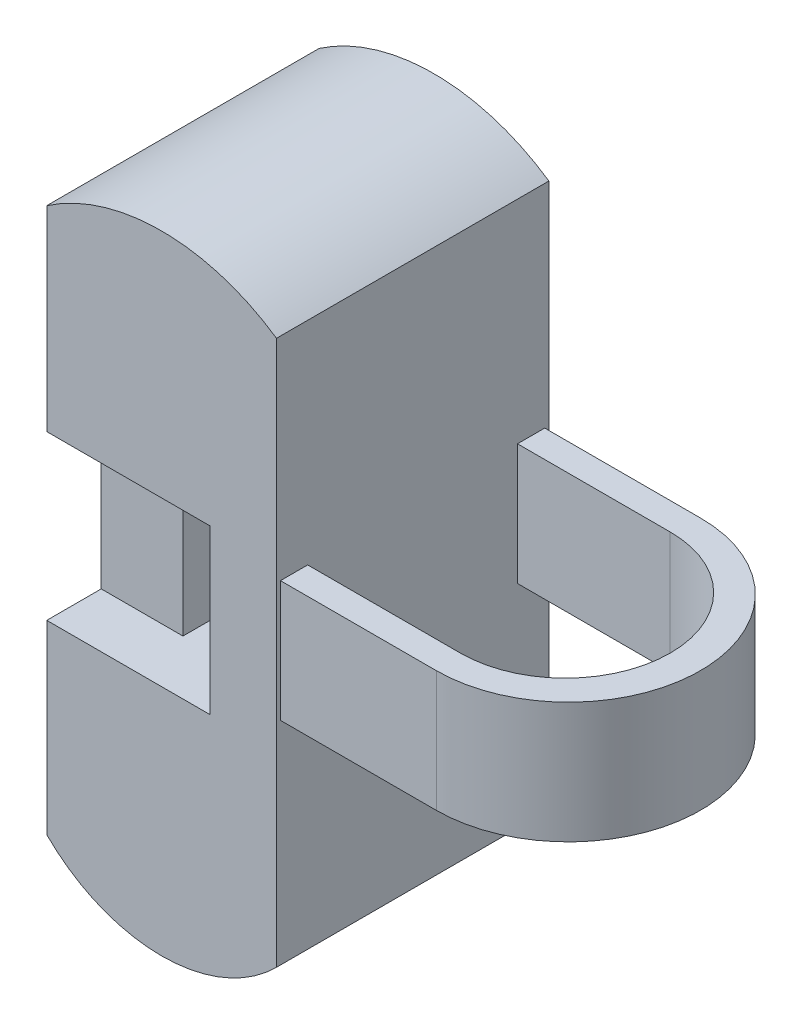
ISO-10303-21;
HEADER;
FILE_DESCRIPTION(('STEP AP214'),'2;1');
FILE_NAME('part.step','',(''),(''),'','','');
FILE_SCHEMA(('AUTOMOTIVE_DESIGN { 1 0 10303 214 1 1 1 1 }'));
ENDSEC;
DATA;
#1=APPLICATION_CONTEXT('core data for automotive mechanical design processes');
#2=APPLICATION_PROTOCOL_DEFINITION('international standard','automotive_design',2000,#1);
#3=PRODUCT_CONTEXT('',#1,'mechanical');
#4=PRODUCT('Part','Part','',(#3));
#5=PRODUCT_RELATED_PRODUCT_CATEGORY('part','',(#4));
#6=PRODUCT_DEFINITION_FORMATION('','',#4);
#7=PRODUCT_DEFINITION_CONTEXT('part definition',#1,'design');
#8=PRODUCT_DEFINITION('design','',#6,#7);
#9=PRODUCT_DEFINITION_SHAPE('','',#8);
#10=(LENGTH_UNIT() NAMED_UNIT(*) SI_UNIT(.MILLI.,.METRE.));
#11=(NAMED_UNIT(*) PLANE_ANGLE_UNIT() SI_UNIT($,.RADIAN.));
#12=(NAMED_UNIT(*) SI_UNIT($,.STERADIAN.) SOLID_ANGLE_UNIT());
#13=UNCERTAINTY_MEASURE_WITH_UNIT(LENGTH_MEASURE(1.E-05),#10,'distance_accuracy_value','');
#14=(GEOMETRIC_REPRESENTATION_CONTEXT(3) GLOBAL_UNCERTAINTY_ASSIGNED_CONTEXT((#13)) GLOBAL_UNIT_ASSIGNED_CONTEXT((#10,
#11,#12)) REPRESENTATION_CONTEXT('',''));
#15=CARTESIAN_POINT('',(0.,0.,0.));
#16=DIRECTION('',(0.,0.,1.));
#17=DIRECTION('',(1.,0.,0.));
#18=AXIS2_PLACEMENT_3D('',#15,#16,#17);
#19=CARTESIAN_POINT('',(0.,0.,5.));
#20=DIRECTION('',(1.,0.,0.));
#21=DIRECTION('',(0.,1.,0.));
#22=AXIS2_PLACEMENT_3D('',#19,#20,#21);
#23=PLANE('',#22);
#24=DIRECTION('',(0.,0.,1.));
#25=VECTOR('',#24,1.);
#26=CARTESIAN_POINT('',(0.,-13.1854201107124,3.));
#27=LINE('',#26,#25);
#28=CARTESIAN_POINT('',(0.,-13.1854201107124,3.));
#29=VERTEX_POINT('',#28);
#30=CARTESIAN_POINT('',(0.,-13.1854201107124,5.));
#31=VERTEX_POINT('',#30);
#32=EDGE_CURVE('E345',#29,#31,#27,.T.);
#33=ORIENTED_EDGE('',*,*,#32,.F.);
#34=DIRECTION('',(0.,-1.,0.));
#35=VECTOR('',#34,1.);
#36=CARTESIAN_POINT('',(0.,-7.18542011071244,3.));
#37=LINE('',#36,#35);
#38=CARTESIAN_POINT('',(0.,-7.18542011071244,3.));
#39=VERTEX_POINT('',#38);
#40=EDGE_CURVE('E175',#39,#29,#37,.T.);
#41=ORIENTED_EDGE('',*,*,#40,.F.);
#42=DIRECTION('',(0.,0.,1.));
#43=VECTOR('',#42,1.);
#44=CARTESIAN_POINT('',(0.,-7.18542011071244,3.));
#45=LINE('',#44,#43);
#46=CARTESIAN_POINT('',(0.,-7.18542011071244,5.));
#47=VERTEX_POINT('',#46);
#48=EDGE_CURVE('E348',#39,#47,#45,.T.);
#49=ORIENTED_EDGE('',*,*,#48,.T.);
#50=DIRECTION('',(0.,-1.,0.));
#51=VECTOR('',#50,1.);
#52=CARTESIAN_POINT('',(0.,0.,5.));
#53=LINE('',#52,#51);
#54=CARTESIAN_POINT('',(0.,0.,5.));
#55=VERTEX_POINT('',#54);
#56=EDGE_CURVE('E236',#55,#47,#53,.T.);
#57=ORIENTED_EDGE('',*,*,#56,.F.);
#58=DIRECTION('',(0.,0.,-1.));
#59=VECTOR('',#58,1.);
#60=CARTESIAN_POINT('',(0.,0.,5.));
#61=LINE('',#60,#59);
#62=CARTESIAN_POINT('',(0.,0.,-5.));
#63=VERTEX_POINT('',#62);
#64=EDGE_CURVE('E249',#55,#63,#61,.T.);
#65=ORIENTED_EDGE('',*,*,#64,.T.);
#66=DIRECTION('',(0.,-1.,0.));
#67=VECTOR('',#66,1.);
#68=CARTESIAN_POINT('',(0.,0.,-5.));
#69=LINE('',#68,#67);
#70=CARTESIAN_POINT('',(0.,-7.18542011071244,-5.));
#71=VERTEX_POINT('',#70);
#72=EDGE_CURVE('E250',#63,#71,#69,.T.);
#73=ORIENTED_EDGE('',*,*,#72,.T.);
#74=DIRECTION('',(0.,0.,-1.));
#75=VECTOR('',#74,1.);
#76=CARTESIAN_POINT('',(0.,-7.18542011071244,-3.));
#77=LINE('',#76,#75);
#78=CARTESIAN_POINT('',(0.,-7.18542011071244,-3.));
#79=VERTEX_POINT('',#78);
#80=EDGE_CURVE('E362',#79,#71,#77,.T.);
#81=ORIENTED_EDGE('',*,*,#80,.F.);
#82=DIRECTION('',(0.,-1.,0.));
#83=VECTOR('',#82,1.);
#84=CARTESIAN_POINT('',(0.,-7.18542011071244,-3.));
#85=LINE('',#84,#83);
#86=CARTESIAN_POINT('',(0.,-13.1854201107124,-3.));
#87=VERTEX_POINT('',#86);
#88=EDGE_CURVE('E356',#79,#87,#85,.T.);
#89=ORIENTED_EDGE('',*,*,#88,.T.);
#90=DIRECTION('',(0.,0.,-1.));
#91=VECTOR('',#90,1.);
#92=CARTESIAN_POINT('',(0.,-13.1854201107124,-3.));
#93=LINE('',#92,#91);
#94=CARTESIAN_POINT('',(0.,-13.1854201107124,-5.));
#95=VERTEX_POINT('',#94);
#96=EDGE_CURVE('E361',#87,#95,#93,.T.);
#97=ORIENTED_EDGE('',*,*,#96,.T.);
#98=CARTESIAN_POINT('',(0.,-20.,-5.));
#99=VERTEX_POINT('',#98);
#100=EDGE_CURVE('E235',#95,#99,#69,.T.);
#101=ORIENTED_EDGE('',*,*,#100,.T.);
#102=DIRECTION('',(0.,0.,-1.));
#103=VECTOR('',#102,1.);
#104=CARTESIAN_POINT('',(0.,-20.,5.));
#105=LINE('',#104,#103);
#106=CARTESIAN_POINT('',(0.,-20.,5.));
#107=VERTEX_POINT('',#106);
#108=EDGE_CURVE('E267',#107,#99,#105,.T.);
#109=ORIENTED_EDGE('',*,*,#108,.F.);
#110=EDGE_CURVE('E240',#31,#107,#53,.T.);
#111=ORIENTED_EDGE('',*,*,#110,.F.);
#112=EDGE_LOOP('',(#33,#41,#49,#57,#65,#73,#81,#89,#97,#101,#109,#111));
#113=FACE_BOUND('',#112,.T.);
#114=ADVANCED_FACE('F33',(#113),#23,.F.);
#115=CARTESIAN_POINT('',(4.21707699545243,-15.7829230045476,5.));
#116=DIRECTION('',(0.,0.,-1.));
#117=DIRECTION('',(-1.,0.,0.));
#118=AXIS2_PLACEMENT_3D('',#115,#116,#117);
#119=PLANE('',#118);
#120=DIRECTION('',(1.,0.,0.));
#121=VECTOR('',#120,1.);
#122=CARTESIAN_POINT('',(3.,-13.1854201107124,5.));
#123=LINE('',#122,#121);
#124=CARTESIAN_POINT('',(6.,-13.1854201107124,5.));
#125=VERTEX_POINT('',#124);
#126=EDGE_CURVE('E365',#31,#125,#123,.T.);
#127=ORIENTED_EDGE('',*,*,#126,.F.);
#128=ORIENTED_EDGE('',*,*,#110,.T.);
#129=CARTESIAN_POINT('',(4.21707699545243,-15.7829230045476,5.));
#130=DIRECTION('',(0.,0.,-1.));
#131=DIRECTION('',(-1.,0.,0.));
#132=AXIS2_PLACEMENT_3D('',#129,#130,#131);
#133=CIRCLE('',#132,5.96384748054041);
#134=CARTESIAN_POINT('',(8.43415399090486,-20.,5.));
#135=VERTEX_POINT('',#134);
#136=EDGE_CURVE('E239',#135,#107,#133,.T.);
#137=ORIENTED_EDGE('',*,*,#136,.F.);
#138=DIRECTION('',(0.,-1.,0.));
#139=VECTOR('',#138,1.);
#140=CARTESIAN_POINT('',(8.43415399090486,0.,5.));
#141=LINE('',#140,#139);
#142=CARTESIAN_POINT('',(8.43415399090486,0.,5.));
#143=VERTEX_POINT('',#142);
#144=EDGE_CURVE('E243',#143,#135,#141,.T.);
#145=ORIENTED_EDGE('',*,*,#144,.F.);
#146=CARTESIAN_POINT('',(4.21707699545243,-6.16071428571429,5.));
#147=DIRECTION('',(0.,0.,-1.));
#148=DIRECTION('',(-1.,0.,0.));
#149=AXIS2_PLACEMENT_3D('',#146,#147,#148);
#150=CIRCLE('',#149,7.46579794099587);
#151=EDGE_CURVE('E246',#55,#143,#150,.T.);
#152=ORIENTED_EDGE('',*,*,#151,.F.);
#153=ORIENTED_EDGE('',*,*,#56,.T.);
#154=DIRECTION('',(1.,0.,0.));
#155=VECTOR('',#154,1.);
#156=CARTESIAN_POINT('',(3.,-7.18542011071244,5.));
#157=LINE('',#156,#155);
#158=CARTESIAN_POINT('',(6.,-7.18542011071244,5.));
#159=VERTEX_POINT('',#158);
#160=EDGE_CURVE('E371',#47,#159,#157,.T.);
#161=ORIENTED_EDGE('',*,*,#160,.T.);
#162=DIRECTION('',(0.,-1.,0.));
#163=VECTOR('',#162,1.);
#164=CARTESIAN_POINT('',(6.,-7.18542011071244,5.));
#165=LINE('',#164,#163);
#166=EDGE_CURVE('E374',#159,#125,#165,.T.);
#167=ORIENTED_EDGE('',*,*,#166,.T.);
#168=EDGE_LOOP('',(#127,#128,#137,#145,#152,#153,#161,#167));
#169=FACE_BOUND('',#168,.T.);
#170=ADVANCED_FACE('F336',(#169),#119,.F.);
#171=CARTESIAN_POINT('',(4.21707699545243,-15.7829230045476,-5.));
#172=DIRECTION('',(0.,0.,-1.));
#173=DIRECTION('',(-1.,0.,0.));
#174=AXIS2_PLACEMENT_3D('',#171,#172,#173);
#175=PLANE('',#174);
#176=DIRECTION('',(1.,0.,0.));
#177=VECTOR('',#176,1.);
#178=CARTESIAN_POINT('',(3.,-7.18542011071244,-5.));
#179=LINE('',#178,#177);
#180=CARTESIAN_POINT('',(6.,-7.18542011071244,-5.));
#181=VERTEX_POINT('',#180);
#182=EDGE_CURVE('E190',#71,#181,#179,.T.);
#183=ORIENTED_EDGE('',*,*,#182,.F.);
#184=ORIENTED_EDGE('',*,*,#72,.F.);
#185=CARTESIAN_POINT('',(4.21707699545243,-6.16071428571429,-5.));
#186=DIRECTION('',(0.,0.,-1.));
#187=DIRECTION('',(-1.,0.,0.));
#188=AXIS2_PLACEMENT_3D('',#185,#186,#187);
#189=CIRCLE('',#188,7.46579794099587);
#190=CARTESIAN_POINT('',(8.43415399090486,0.,-5.));
#191=VERTEX_POINT('',#190);
#192=EDGE_CURVE('E259',#63,#191,#189,.T.);
#193=ORIENTED_EDGE('',*,*,#192,.T.);
#194=DIRECTION('',(0.,-1.,0.));
#195=VECTOR('',#194,1.);
#196=CARTESIAN_POINT('',(8.43415399090486,0.,-5.));
#197=LINE('',#196,#195);
#198=CARTESIAN_POINT('',(8.43415399090486,-20.,-5.));
#199=VERTEX_POINT('',#198);
#200=EDGE_CURVE('E256',#191,#199,#197,.T.);
#201=ORIENTED_EDGE('',*,*,#200,.T.);
#202=CARTESIAN_POINT('',(4.21707699545243,-15.7829230045476,-5.));
#203=DIRECTION('',(0.,0.,-1.));
#204=DIRECTION('',(-1.,0.,0.));
#205=AXIS2_PLACEMENT_3D('',#202,#203,#204);
#206=CIRCLE('',#205,5.96384748054041);
#207=EDGE_CURVE('E253',#199,#99,#206,.T.);
#208=ORIENTED_EDGE('',*,*,#207,.T.);
#209=ORIENTED_EDGE('',*,*,#100,.F.);
#210=DIRECTION('',(1.,0.,0.));
#211=VECTOR('',#210,1.);
#212=CARTESIAN_POINT('',(3.,-13.1854201107124,-5.));
#213=LINE('',#212,#211);
#214=CARTESIAN_POINT('',(6.,-13.1854201107124,-5.));
#215=VERTEX_POINT('',#214);
#216=EDGE_CURVE('E368',#95,#215,#213,.T.);
#217=ORIENTED_EDGE('',*,*,#216,.T.);
#218=DIRECTION('',(0.,-1.,0.));
#219=VECTOR('',#218,1.);
#220=CARTESIAN_POINT('',(6.,-7.18542011071244,-5.));
#221=LINE('',#220,#219);
#222=EDGE_CURVE('E194',#181,#215,#221,.T.);
#223=ORIENTED_EDGE('',*,*,#222,.F.);
#224=EDGE_LOOP('',(#183,#184,#193,#201,#208,#209,#217,#223));
#225=FACE_BOUND('',#224,.T.);
#226=ADVANCED_FACE('F341',(#225),#175,.T.);
#227=CARTESIAN_POINT('',(3.,-7.18542011071244,-5.));
#228=DIRECTION('',(-1.,0.,0.));
#229=DIRECTION('',(0.,-1.,0.));
#230=AXIS2_PLACEMENT_3D('',#227,#228,#229);
#231=PLANE('',#230);
#232=DIRECTION('',(0.,0.,1.));
#233=VECTOR('',#232,1.);
#234=CARTESIAN_POINT('',(3.,-7.18542011071244,-5.));
#235=LINE('',#234,#233);
#236=CARTESIAN_POINT('',(3.,-7.18542011071244,-3.));
#237=VERTEX_POINT('',#236);
#238=CARTESIAN_POINT('',(3.,-7.18542011071244,3.));
#239=VERTEX_POINT('',#238);
#240=EDGE_CURVE('E186',#237,#239,#235,.T.);
#241=ORIENTED_EDGE('',*,*,#240,.T.);
#242=DIRECTION('',(0.,-1.,0.));
#243=VECTOR('',#242,1.);
#244=CARTESIAN_POINT('',(3.,-7.18542011071244,3.));
#245=LINE('',#244,#243);
#246=CARTESIAN_POINT('',(3.,-13.1854201107124,3.));
#247=VERTEX_POINT('',#246);
#248=EDGE_CURVE('E172',#239,#247,#245,.T.);
#249=ORIENTED_EDGE('',*,*,#248,.T.);
#250=DIRECTION('',(0.,0.,1.));
#251=VECTOR('',#250,1.);
#252=CARTESIAN_POINT('',(3.,-13.1854201107124,-5.));
#253=LINE('',#252,#251);
#254=CARTESIAN_POINT('',(3.,-13.1854201107124,-3.));
#255=VERTEX_POINT('',#254);
#256=EDGE_CURVE('E184',#255,#247,#253,.T.);
#257=ORIENTED_EDGE('',*,*,#256,.F.);
#258=DIRECTION('',(0.,-1.,0.));
#259=VECTOR('',#258,1.);
#260=CARTESIAN_POINT('',(3.,-7.18542011071244,-3.));
#261=LINE('',#260,#259);
#262=EDGE_CURVE('E47',#237,#255,#261,.T.);
#263=ORIENTED_EDGE('',*,*,#262,.F.);
#264=EDGE_LOOP('',(#241,#249,#257,#263));
#265=FACE_BOUND('',#264,.T.);
#266=ADVANCED_FACE('F183',(#265),#231,.F.);
#267=CARTESIAN_POINT('',(14.1551167286333,-7.77915571836,0.00319627745914985));
#268=DIRECTION('',(0.,1.,0.));
#269=DIRECTION('',(0.,0.,1.));
#270=AXIS2_PLACEMENT_3D('',#267,#268,#269);
#271=PLANE('',#270);
#272=DIRECTION('',(0.,0.,1.));
#273=VECTOR('',#272,1.);
#274=CARTESIAN_POINT('',(8.43415399090486,-7.77915571836,5.));
#275=LINE('',#274,#273);
#276=CARTESIAN_POINT('',(8.43415399090486,-7.77915571836,-4.84818106149465));
#277=VERTEX_POINT('',#276);
#278=CARTESIAN_POINT('',(8.43415399090486,-7.77915571836,-3.84818106149465));
#279=VERTEX_POINT('',#278);
#280=EDGE_CURVE('E280',#277,#279,#275,.T.);
#281=ORIENTED_EDGE('',*,*,#280,.T.);
#282=DIRECTION('',(1.,0.,0.));
#283=VECTOR('',#282,1.);
#284=CARTESIAN_POINT('',(8.43415399090486,-7.77915571836,-3.84818106149465));
#285=LINE('',#284,#283);
#286=CARTESIAN_POINT('',(14.0414598424932,-7.77915571836,-3.84818106149465));
#287=VERTEX_POINT('',#286);
#288=EDGE_CURVE('E204',#279,#287,#285,.T.);
#289=ORIENTED_EDGE('',*,*,#288,.T.);
#290=CARTESIAN_POINT('',(14.0414598424932,-7.77915571836,0.00319627745914985));
#291=DIRECTION('',(0.,-1.,0.));
#292=DIRECTION('',(0.,0.,-1.));
#293=AXIS2_PLACEMENT_3D('',#290,#291,#292);
#294=CIRCLE('',#293,3.8513773389538);
#295=CARTESIAN_POINT('',(14.0414598424932,-7.77915571836,3.85457361641295));
#296=VERTEX_POINT('',#295);
#297=EDGE_CURVE('E201',#287,#296,#294,.T.);
#298=ORIENTED_EDGE('',*,*,#297,.T.);
#299=DIRECTION('',(1.,0.,0.));
#300=VECTOR('',#299,1.);
#301=CARTESIAN_POINT('',(8.43415399090486,-7.77915571836,3.85457361641295));
#302=LINE('',#301,#300);
#303=CARTESIAN_POINT('',(8.43415399090486,-7.77915571836,3.85457361641295));
#304=VERTEX_POINT('',#303);
#305=EDGE_CURVE('E198',#304,#296,#302,.T.);
#306=ORIENTED_EDGE('',*,*,#305,.F.);
#307=CARTESIAN_POINT('',(8.43415399090486,-7.77915571836,4.85457361641295));
#308=VERTEX_POINT('',#307);
#309=EDGE_CURVE('E279',#304,#308,#275,.T.);
#310=ORIENTED_EDGE('',*,*,#309,.T.);
#311=DIRECTION('',(1.,0.,0.));
#312=VECTOR('',#311,1.);
#313=CARTESIAN_POINT('',(3.33276440194356,-7.77915571836,4.85457361641295));
#314=LINE('',#313,#312);
#315=CARTESIAN_POINT('',(14.1551167286333,-7.77915571836,4.85457361641295));
#316=VERTEX_POINT('',#315);
#317=EDGE_CURVE('E216',#308,#316,#314,.T.);
#318=ORIENTED_EDGE('',*,*,#317,.T.);
#319=CARTESIAN_POINT('',(14.1551167286333,-7.77915571836,0.00319627745914985));
#320=DIRECTION('',(0.,1.,0.));
#321=DIRECTION('',(0.,0.,1.));
#322=AXIS2_PLACEMENT_3D('',#319,#320,#321);
#323=CIRCLE('',#322,4.8513773389538);
#324=CARTESIAN_POINT('',(14.1551167286333,-7.77915571836,-4.84818106149465));
#325=VERTEX_POINT('',#324);
#326=EDGE_CURVE('E218',#316,#325,#323,.T.);
#327=ORIENTED_EDGE('',*,*,#326,.T.);
#328=DIRECTION('',(1.,0.,0.));
#329=VECTOR('',#328,1.);
#330=CARTESIAN_POINT('',(3.33276440194356,-7.77915571836,-4.84818106149465));
#331=LINE('',#330,#329);
#332=EDGE_CURVE('E222',#277,#325,#331,.T.);
#333=ORIENTED_EDGE('',*,*,#332,.F.);
#334=EDGE_LOOP('',(#281,#289,#298,#306,#310,#318,#327,#333));
#335=FACE_BOUND('',#334,.T.);
#336=ADVANCED_FACE('F307',(#335),#271,.T.);
#337=CARTESIAN_POINT('',(14.1551167286333,-12.22084428164,0.00319627745914985));
#338=DIRECTION('',(0.,1.,0.));
#339=DIRECTION('',(0.,0.,1.));
#340=AXIS2_PLACEMENT_3D('',#337,#338,#339);
#341=PLANE('',#340);
#342=DIRECTION('',(1.,0.,0.));
#343=VECTOR('',#342,1.);
#344=CARTESIAN_POINT('',(14.1551167286333,-12.22084428164,-3.84818106149465));
#345=LINE('',#344,#343);
#346=CARTESIAN_POINT('',(8.43415399090486,-12.22084428164,-3.84818106149465));
#347=VERTEX_POINT('',#346);
#348=CARTESIAN_POINT('',(14.0414598424932,-12.22084428164,-3.84818106149465));
#349=VERTEX_POINT('',#348);
#350=EDGE_CURVE('E11',#347,#349,#345,.T.);
#351=ORIENTED_EDGE('',*,*,#350,.F.);
#352=DIRECTION('',(0.,0.,1.));
#353=VECTOR('',#352,1.);
#354=CARTESIAN_POINT('',(8.43415399090486,-12.22084428164,5.));
#355=LINE('',#354,#353);
#356=CARTESIAN_POINT('',(8.43415399090486,-12.22084428164,-4.84818106149465));
#357=VERTEX_POINT('',#356);
#358=EDGE_CURVE('E271',#357,#347,#355,.T.);
#359=ORIENTED_EDGE('',*,*,#358,.F.);
#360=DIRECTION('',(1.,0.,0.));
#361=VECTOR('',#360,1.);
#362=CARTESIAN_POINT('',(3.33276440194356,-12.22084428164,-4.84818106149465));
#363=LINE('',#362,#361);
#364=CARTESIAN_POINT('',(14.1551167286333,-12.22084428164,-4.84818106149465));
#365=VERTEX_POINT('',#364);
#366=EDGE_CURVE('E219',#357,#365,#363,.T.);
#367=ORIENTED_EDGE('',*,*,#366,.T.);
#368=CARTESIAN_POINT('',(14.1551167286333,-12.22084428164,0.00319627745914985));
#369=DIRECTION('',(0.,1.,0.));
#370=DIRECTION('',(0.,0.,1.));
#371=AXIS2_PLACEMENT_3D('',#368,#369,#370);
#372=CIRCLE('',#371,4.8513773389538);
#373=CARTESIAN_POINT('',(14.1551167286333,-12.22084428164,4.85457361641295));
#374=VERTEX_POINT('',#373);
#375=EDGE_CURVE('E226',#374,#365,#372,.T.);
#376=ORIENTED_EDGE('',*,*,#375,.F.);
#377=DIRECTION('',(1.,0.,0.));
#378=VECTOR('',#377,1.);
#379=CARTESIAN_POINT('',(3.33276440194356,-12.22084428164,4.85457361641295));
#380=LINE('',#379,#378);
#381=CARTESIAN_POINT('',(8.43415399090486,-12.22084428164,4.85457361641295));
#382=VERTEX_POINT('',#381);
#383=EDGE_CURVE('E210',#382,#374,#380,.T.);
#384=ORIENTED_EDGE('',*,*,#383,.F.);
#385=CARTESIAN_POINT('',(8.43415399090486,-12.22084428164,3.85457361641295));
#386=VERTEX_POINT('',#385);
#387=EDGE_CURVE('E270',#386,#382,#355,.T.);
#388=ORIENTED_EDGE('',*,*,#387,.F.);
#389=DIRECTION('',(1.,0.,0.));
#390=VECTOR('',#389,1.);
#391=CARTESIAN_POINT('',(14.1551167286333,-12.22084428164,3.85457361641295));
#392=LINE('',#391,#390);
#393=CARTESIAN_POINT('',(14.0414598424932,-12.22084428164,3.85457361641295));
#394=VERTEX_POINT('',#393);
#395=EDGE_CURVE('E283',#386,#394,#392,.T.);
#396=ORIENTED_EDGE('',*,*,#395,.T.);
#397=CARTESIAN_POINT('',(14.0414598424932,-12.22084428164,0.00319627745914985));
#398=DIRECTION('',(0.,1.,0.));
#399=DIRECTION('',(0.,0.,1.));
#400=AXIS2_PLACEMENT_3D('',#397,#398,#399);
#401=CIRCLE('',#400,3.8513773389538);
#402=EDGE_CURVE('E40',#349,#394,#401,.F.);
#403=ORIENTED_EDGE('',*,*,#402,.F.);
#404=EDGE_LOOP('',(#351,#359,#367,#376,#384,#388,#396,#403));
#405=FACE_BOUND('',#404,.T.);
#406=ADVANCED_FACE('F294',(#405),#341,.F.);
#407=CARTESIAN_POINT('',(4.21707699545243,-15.7829230045476,5.));
#408=DIRECTION('',(0.,0.,-1.));
#409=DIRECTION('',(-1.,0.,0.));
#410=AXIS2_PLACEMENT_3D('',#407,#408,#409);
#411=CYLINDRICAL_SURFACE('',#410,5.96384748054041);
#412=ORIENTED_EDGE('',*,*,#207,.F.);
#413=DIRECTION('',(0.,0.,-1.));
#414=VECTOR('',#413,1.);
#415=CARTESIAN_POINT('',(8.43415399090486,-20.,5.));
#416=LINE('',#415,#414);
#417=EDGE_CURVE('E265',#135,#199,#416,.T.);
#418=ORIENTED_EDGE('',*,*,#417,.F.);
#419=ORIENTED_EDGE('',*,*,#136,.T.);
#420=ORIENTED_EDGE('',*,*,#108,.T.);
#421=EDGE_LOOP('',(#412,#418,#419,#420));
#422=FACE_BOUND('',#421,.T.);
#423=ADVANCED_FACE('F402',(#422),#411,.T.);
#424=CARTESIAN_POINT('',(8.43415399090486,0.,5.));
#425=DIRECTION('',(1.,0.,0.));
#426=DIRECTION('',(0.,1.,0.));
#427=AXIS2_PLACEMENT_3D('',#424,#425,#426);
#428=PLANE('',#427);
#429=ORIENTED_EDGE('',*,*,#358,.T.);
#430=DIRECTION('',(0.,1.,0.));
#431=VECTOR('',#430,1.);
#432=CARTESIAN_POINT('',(8.43415399090486,-12.27915571836,-3.84818106149465));
#433=LINE('',#432,#431);
#434=EDGE_CURVE('E208',#347,#279,#433,.T.);
#435=ORIENTED_EDGE('',*,*,#434,.T.);
#436=ORIENTED_EDGE('',*,*,#280,.F.);
#437=DIRECTION('',(0.,1.,0.));
#438=VECTOR('',#437,1.);
#439=CARTESIAN_POINT('',(8.43415399090486,0.,-4.84818106149465));
#440=LINE('',#439,#438);
#441=EDGE_CURVE('E274',#357,#277,#440,.T.);
#442=ORIENTED_EDGE('',*,*,#441,.F.);
#443=EDGE_LOOP('',(#429,#435,#436,#442));
#444=FACE_BOUND('',#443,.T.);
#445=DIRECTION('',(0.,1.,0.));
#446=VECTOR('',#445,1.);
#447=CARTESIAN_POINT('',(8.43415399090486,-12.27915571836,3.85457361641295));
#448=LINE('',#447,#446);
#449=EDGE_CURVE('E207',#386,#304,#448,.T.);
#450=ORIENTED_EDGE('',*,*,#449,.F.);
#451=ORIENTED_EDGE('',*,*,#387,.T.);
#452=DIRECTION('',(0.,1.,0.));
#453=VECTOR('',#452,1.);
#454=CARTESIAN_POINT('',(8.43415399090486,0.,4.85457361641295));
#455=LINE('',#454,#453);
#456=EDGE_CURVE('E276',#382,#308,#455,.T.);
#457=ORIENTED_EDGE('',*,*,#456,.T.);
#458=ORIENTED_EDGE('',*,*,#309,.F.);
#459=EDGE_LOOP('',(#450,#451,#457,#458));
#460=FACE_BOUND('',#459,.T.);
#461=ORIENTED_EDGE('',*,*,#200,.F.);
#462=DIRECTION('',(0.,0.,-1.));
#463=VECTOR('',#462,1.);
#464=CARTESIAN_POINT('',(8.43415399090486,0.,5.));
#465=LINE('',#464,#463);
#466=EDGE_CURVE('E263',#143,#191,#465,.T.);
#467=ORIENTED_EDGE('',*,*,#466,.F.);
#468=ORIENTED_EDGE('',*,*,#144,.T.);
#469=ORIENTED_EDGE('',*,*,#417,.T.);
#470=EDGE_LOOP('',(#461,#467,#468,#469));
#471=FACE_BOUND('',#470,.T.);
#472=ADVANCED_FACE('F302',(#444,#460,#471),#428,.T.);
#473=CARTESIAN_POINT('',(4.21707699545243,-6.16071428571429,5.));
#474=DIRECTION('',(0.,0.,-1.));
#475=DIRECTION('',(-1.,0.,0.));
#476=AXIS2_PLACEMENT_3D('',#473,#474,#475);
#477=CYLINDRICAL_SURFACE('',#476,7.46579794099587);
#478=ORIENTED_EDGE('',*,*,#192,.F.);
#479=ORIENTED_EDGE('',*,*,#64,.F.);
#480=ORIENTED_EDGE('',*,*,#151,.T.);
#481=ORIENTED_EDGE('',*,*,#466,.T.);
#482=EDGE_LOOP('',(#478,#479,#480,#481));
#483=FACE_BOUND('',#482,.T.);
#484=ADVANCED_FACE('F397',(#483),#477,.T.);
#485=CARTESIAN_POINT('',(3.33276440194356,-7.77915571836,4.85457361641295));
#486=DIRECTION('',(0.,0.,-1.));
#487=DIRECTION('',(-1.,0.,0.));
#488=AXIS2_PLACEMENT_3D('',#485,#486,#487);
#489=PLANE('',#488);
#490=ORIENTED_EDGE('',*,*,#456,.F.);
#491=ORIENTED_EDGE('',*,*,#383,.T.);
#492=DIRECTION('',(0.,-1.,0.));
#493=VECTOR('',#492,1.);
#494=CARTESIAN_POINT('',(14.1551167286333,-7.77915571836,4.85457361641295));
#495=LINE('',#494,#493);
#496=EDGE_CURVE('E232',#316,#374,#495,.T.);
#497=ORIENTED_EDGE('',*,*,#496,.F.);
#498=ORIENTED_EDGE('',*,*,#317,.F.);
#499=EDGE_LOOP('',(#490,#491,#497,#498));
#500=FACE_BOUND('',#499,.T.);
#501=ADVANCED_FACE('F311',(#500),#489,.F.);
#502=CARTESIAN_POINT('',(14.1551167286333,-7.77915571836,0.00319627745914985));
#503=DIRECTION('',(0.,-1.,0.));
#504=DIRECTION('',(0.,0.,-1.));
#505=AXIS2_PLACEMENT_3D('',#502,#503,#504);
#506=CYLINDRICAL_SURFACE('',#505,4.8513773389538);
#507=ORIENTED_EDGE('',*,*,#375,.T.);
#508=DIRECTION('',(0.,-1.,0.));
#509=VECTOR('',#508,1.);
#510=CARTESIAN_POINT('',(14.1551167286333,-7.77915571836,-4.84818106149465));
#511=LINE('',#510,#509);
#512=EDGE_CURVE('E224',#325,#365,#511,.T.);
#513=ORIENTED_EDGE('',*,*,#512,.F.);
#514=ORIENTED_EDGE('',*,*,#326,.F.);
#515=ORIENTED_EDGE('',*,*,#496,.T.);
#516=EDGE_LOOP('',(#507,#513,#514,#515));
#517=FACE_BOUND('',#516,.T.);
#518=ADVANCED_FACE('F314',(#517),#506,.T.);
#519=CARTESIAN_POINT('',(3.33276440194356,-7.77915571836,-4.84818106149465));
#520=DIRECTION('',(0.,0.,-1.));
#521=DIRECTION('',(-1.,0.,0.));
#522=AXIS2_PLACEMENT_3D('',#519,#520,#521);
#523=PLANE('',#522);
#524=ORIENTED_EDGE('',*,*,#366,.F.);
#525=ORIENTED_EDGE('',*,*,#441,.T.);
#526=ORIENTED_EDGE('',*,*,#332,.T.);
#527=ORIENTED_EDGE('',*,*,#512,.T.);
#528=EDGE_LOOP('',(#524,#525,#526,#527));
#529=FACE_BOUND('',#528,.T.);
#530=ADVANCED_FACE('F325',(#529),#523,.T.);
#531=CARTESIAN_POINT('',(8.43415399090486,-12.27915571836,-3.84818106149465));
#532=DIRECTION('',(0.,0.,1.));
#533=DIRECTION('',(1.,0.,0.));
#534=AXIS2_PLACEMENT_3D('',#531,#532,#533);
#535=PLANE('',#534);
#536=ORIENTED_EDGE('',*,*,#350,.T.);
#537=DIRECTION('',(0.,1.,0.));
#538=VECTOR('',#537,1.);
#539=CARTESIAN_POINT('',(14.0414598424932,-12.27915571836,-3.84818106149465));
#540=LINE('',#539,#538);
#541=EDGE_CURVE('E211',#349,#287,#540,.T.);
#542=ORIENTED_EDGE('',*,*,#541,.T.);
#543=ORIENTED_EDGE('',*,*,#288,.F.);
#544=ORIENTED_EDGE('',*,*,#434,.F.);
#545=EDGE_LOOP('',(#536,#542,#543,#544));
#546=FACE_BOUND('',#545,.T.);
#547=ADVANCED_FACE('F323',(#546),#535,.T.);
#548=CARTESIAN_POINT('',(14.0414598424932,-12.27915571836,0.00319627745914985));
#549=DIRECTION('',(0.,1.,0.));
#550=DIRECTION('',(0.,0.,1.));
#551=AXIS2_PLACEMENT_3D('',#548,#549,#550);
#552=CYLINDRICAL_SURFACE('',#551,3.8513773389538);
#553=ORIENTED_EDGE('',*,*,#402,.T.);
#554=DIRECTION('',(0.,1.,0.));
#555=VECTOR('',#554,1.);
#556=CARTESIAN_POINT('',(14.0414598424932,-12.27915571836,3.85457361641295));
#557=LINE('',#556,#555);
#558=EDGE_CURVE('E213',#394,#296,#557,.T.);
#559=ORIENTED_EDGE('',*,*,#558,.T.);
#560=ORIENTED_EDGE('',*,*,#297,.F.);
#561=ORIENTED_EDGE('',*,*,#541,.F.);
#562=EDGE_LOOP('',(#553,#559,#560,#561));
#563=FACE_BOUND('',#562,.T.);
#564=ADVANCED_FACE('F289',(#563),#552,.F.);
#565=CARTESIAN_POINT('',(8.43415399090486,-12.27915571836,3.85457361641295));
#566=DIRECTION('',(0.,0.,1.));
#567=DIRECTION('',(1.,0.,0.));
#568=AXIS2_PLACEMENT_3D('',#565,#566,#567);
#569=PLANE('',#568);
#570=ORIENTED_EDGE('',*,*,#449,.T.);
#571=ORIENTED_EDGE('',*,*,#305,.T.);
#572=ORIENTED_EDGE('',*,*,#558,.F.);
#573=ORIENTED_EDGE('',*,*,#395,.F.);
#574=EDGE_LOOP('',(#570,#571,#572,#573));
#575=FACE_BOUND('',#574,.T.);
#576=ADVANCED_FACE('F298',(#575),#569,.F.);
#577=CARTESIAN_POINT('',(3.,-7.18542011071244,-5.));
#578=DIRECTION('',(0.,-1.,0.));
#579=DIRECTION('',(0.,0.,-1.));
#580=AXIS2_PLACEMENT_3D('',#577,#578,#579);
#581=PLANE('',#580);
#582=ORIENTED_EDGE('',*,*,#160,.F.);
#583=ORIENTED_EDGE('',*,*,#48,.F.);
#584=DIRECTION('',(-1.,0.,0.));
#585=VECTOR('',#584,1.);
#586=CARTESIAN_POINT('',(3.,-7.18542011071244,3.));
#587=LINE('',#586,#585);
#588=EDGE_CURVE('E351',#239,#39,#587,.T.);
#589=ORIENTED_EDGE('',*,*,#588,.F.);
#590=ORIENTED_EDGE('',*,*,#240,.F.);
#591=DIRECTION('',(-1.,0.,0.));
#592=VECTOR('',#591,1.);
#593=CARTESIAN_POINT('',(3.,-7.18542011071244,-3.));
#594=LINE('',#593,#592);
#595=EDGE_CURVE('E359',#237,#79,#594,.T.);
#596=ORIENTED_EDGE('',*,*,#595,.T.);
#597=ORIENTED_EDGE('',*,*,#80,.T.);
#598=ORIENTED_EDGE('',*,*,#182,.T.);
#599=DIRECTION('',(0.,0.,1.));
#600=VECTOR('',#599,1.);
#601=CARTESIAN_POINT('',(6.,-7.18542011071244,-5.));
#602=LINE('',#601,#600);
#603=EDGE_CURVE('E192',#181,#159,#602,.T.);
#604=ORIENTED_EDGE('',*,*,#603,.T.);
#605=EDGE_LOOP('',(#582,#583,#589,#590,#596,#597,#598,#604));
#606=FACE_BOUND('',#605,.T.);
#607=ADVANCED_FACE('F382',(#606),#581,.T.);
#608=CARTESIAN_POINT('',(6.,-7.18542011071244,-5.));
#609=DIRECTION('',(-1.,0.,0.));
#610=DIRECTION('',(0.,-1.,0.));
#611=AXIS2_PLACEMENT_3D('',#608,#609,#610);
#612=PLANE('',#611);
#613=ORIENTED_EDGE('',*,*,#166,.F.);
#614=ORIENTED_EDGE('',*,*,#603,.F.);
#615=ORIENTED_EDGE('',*,*,#222,.T.);
#616=DIRECTION('',(0.,0.,1.));
#617=VECTOR('',#616,1.);
#618=CARTESIAN_POINT('',(6.,-13.1854201107124,-5.));
#619=LINE('',#618,#617);
#620=EDGE_CURVE('E55',#215,#125,#619,.T.);
#621=ORIENTED_EDGE('',*,*,#620,.T.);
#622=EDGE_LOOP('',(#613,#614,#615,#621));
#623=FACE_BOUND('',#622,.T.);
#624=ADVANCED_FACE('F385',(#623),#612,.T.);
#625=CARTESIAN_POINT('',(3.,-13.1854201107124,-5.));
#626=DIRECTION('',(0.,-1.,0.));
#627=DIRECTION('',(0.,0.,-1.));
#628=AXIS2_PLACEMENT_3D('',#625,#626,#627);
#629=PLANE('',#628);
#630=ORIENTED_EDGE('',*,*,#126,.T.);
#631=ORIENTED_EDGE('',*,*,#620,.F.);
#632=ORIENTED_EDGE('',*,*,#216,.F.);
#633=ORIENTED_EDGE('',*,*,#96,.F.);
#634=DIRECTION('',(-1.,0.,0.));
#635=VECTOR('',#634,1.);
#636=CARTESIAN_POINT('',(3.,-13.1854201107124,-3.));
#637=LINE('',#636,#635);
#638=EDGE_CURVE('E189',#255,#87,#637,.T.);
#639=ORIENTED_EDGE('',*,*,#638,.F.);
#640=ORIENTED_EDGE('',*,*,#256,.T.);
#641=DIRECTION('',(-1.,0.,0.));
#642=VECTOR('',#641,1.);
#643=CARTESIAN_POINT('',(3.,-13.1854201107124,3.));
#644=LINE('',#643,#642);
#645=EDGE_CURVE('E168',#247,#29,#644,.T.);
#646=ORIENTED_EDGE('',*,*,#645,.T.);
#647=ORIENTED_EDGE('',*,*,#32,.T.);
#648=EDGE_LOOP('',(#630,#631,#632,#633,#639,#640,#646,#647));
#649=FACE_BOUND('',#648,.T.);
#650=ADVANCED_FACE('F188',(#649),#629,.F.);
#651=CARTESIAN_POINT('',(0.,0.,-3.));
#652=DIRECTION('',(0.,0.,-1.));
#653=DIRECTION('',(-1.,0.,0.));
#654=AXIS2_PLACEMENT_3D('',#651,#652,#653);
#655=PLANE('',#654);
#656=ORIENTED_EDGE('',*,*,#262,.T.);
#657=ORIENTED_EDGE('',*,*,#638,.T.);
#658=ORIENTED_EDGE('',*,*,#88,.F.);
#659=ORIENTED_EDGE('',*,*,#595,.F.);
#660=EDGE_LOOP('',(#656,#657,#658,#659));
#661=FACE_BOUND('',#660,.T.);
#662=ADVANCED_FACE('F393',(#661),#655,.T.);
#663=CARTESIAN_POINT('',(0.,0.,3.));
#664=DIRECTION('',(0.,0.,-1.));
#665=DIRECTION('',(-1.,0.,0.));
#666=AXIS2_PLACEMENT_3D('',#663,#664,#665);
#667=PLANE('',#666);
#668=ORIENTED_EDGE('',*,*,#248,.F.);
#669=ORIENTED_EDGE('',*,*,#588,.T.);
#670=ORIENTED_EDGE('',*,*,#40,.T.);
#671=ORIENTED_EDGE('',*,*,#645,.F.);
#672=EDGE_LOOP('',(#668,#669,#670,#671));
#673=FACE_BOUND('',#672,.T.);
#674=ADVANCED_FACE('F170',(#673),#667,.F.);
#675=CLOSED_SHELL('',(#114,#170,#226,#266,#336,#406,#423,#472,#484,#501,#518,#530,#547,#564,
#576,#607,#624,#650,#662,#674));
#676=MANIFOLD_SOLID_BREP('B2',#675);
#677=ADVANCED_BREP_SHAPE_REPRESENTATION('',(#18,#676),#14);
#678=SHAPE_DEFINITION_REPRESENTATION(#9,#677);
ENDSEC;
END-ISO-10303-21;
